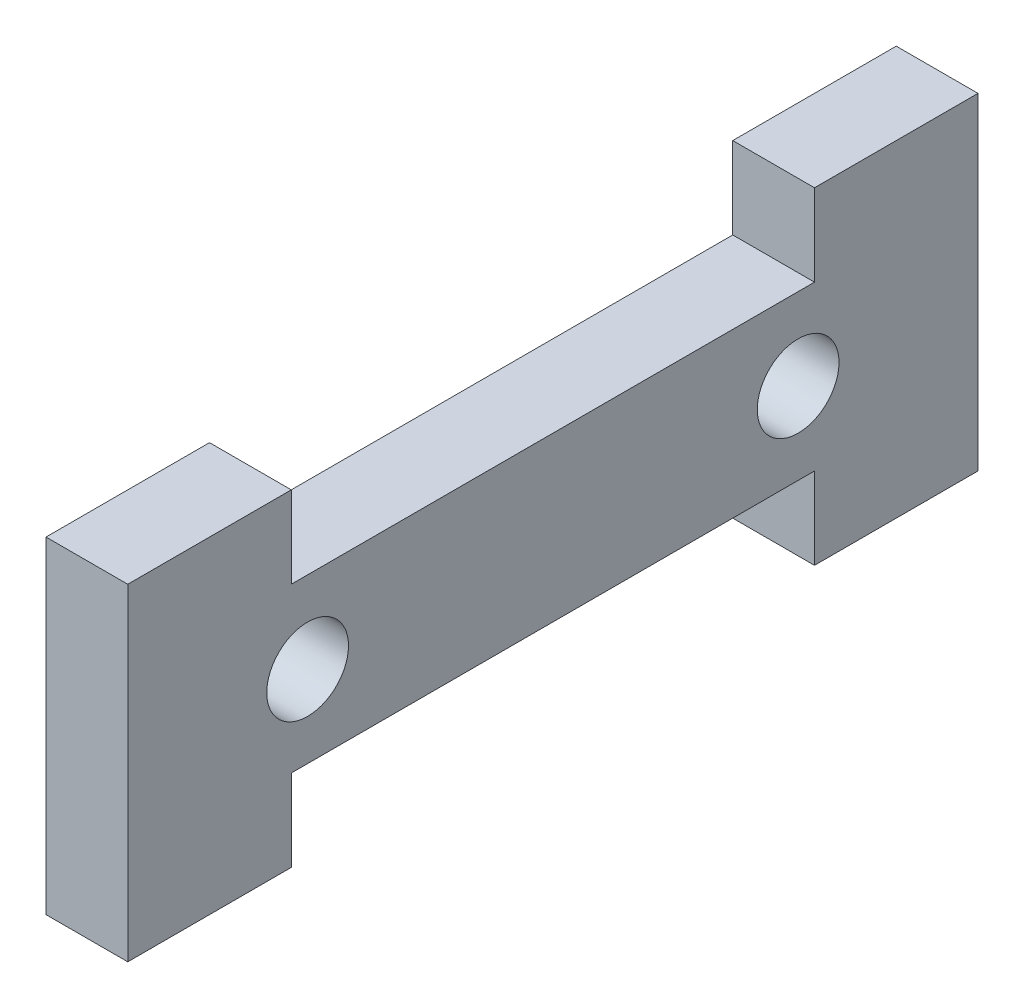
ISO-10303-21;
HEADER;
FILE_DESCRIPTION(('STEP AP214'),'2;1');
FILE_NAME('part.step','',(''),(''),'','','');
FILE_SCHEMA(('AUTOMOTIVE_DESIGN { 1 0 10303 214 1 1 1 1 }'));
ENDSEC;
DATA;
#1=APPLICATION_CONTEXT('core data for automotive mechanical design processes');
#2=APPLICATION_PROTOCOL_DEFINITION('international standard','automotive_design',2000,#1);
#3=PRODUCT_CONTEXT('',#1,'mechanical');
#4=PRODUCT('Part','Part','',(#3));
#5=PRODUCT_RELATED_PRODUCT_CATEGORY('part','',(#4));
#6=PRODUCT_DEFINITION_FORMATION('','',#4);
#7=PRODUCT_DEFINITION_CONTEXT('part definition',#1,'design');
#8=PRODUCT_DEFINITION('design','',#6,#7);
#9=PRODUCT_DEFINITION_SHAPE('','',#8);
#10=(LENGTH_UNIT() NAMED_UNIT(*) SI_UNIT(.MILLI.,.METRE.));
#11=(NAMED_UNIT(*) PLANE_ANGLE_UNIT() SI_UNIT($,.RADIAN.));
#12=(NAMED_UNIT(*) SI_UNIT($,.STERADIAN.) SOLID_ANGLE_UNIT());
#13=UNCERTAINTY_MEASURE_WITH_UNIT(LENGTH_MEASURE(1.E-05),#10,'distance_accuracy_value','');
#14=(GEOMETRIC_REPRESENTATION_CONTEXT(3) GLOBAL_UNCERTAINTY_ASSIGNED_CONTEXT((#13)) GLOBAL_UNIT_ASSIGNED_CONTEXT((#10,
#11,#12)) REPRESENTATION_CONTEXT('',''));
#15=CARTESIAN_POINT('',(0.,0.,0.));
#16=DIRECTION('',(0.,0.,1.));
#17=DIRECTION('',(1.,0.,0.));
#18=AXIS2_PLACEMENT_3D('',#15,#16,#17);
#19=CARTESIAN_POINT('',(6.35,0.,0.));
#20=DIRECTION('',(1.,0.,0.));
#21=DIRECTION('',(0.,0.,-1.));
#22=AXIS2_PLACEMENT_3D('',#19,#20,#21);
#23=PLANE('',#22);
#24=CARTESIAN_POINT('',(6.35,0.,19.05));
#25=DIRECTION('',(1.,0.,0.));
#26=DIRECTION('',(0.,0.,-1.));
#27=AXIS2_PLACEMENT_3D('',#24,#25,#26);
#28=CIRCLE('',#27,3.175);
#29=CARTESIAN_POINT('',(6.35,0.,15.875));
#30=VERTEX_POINT('',#29);
#31=EDGE_CURVE('E174',#30,#30,#28,.T.);
#32=ORIENTED_EDGE('',*,*,#31,.F.);
#33=EDGE_LOOP('',(#32));
#34=FACE_BOUND('',#33,.T.);
#35=DIRECTION('',(0.,-1.,0.));
#36=VECTOR('',#35,1.);
#37=CARTESIAN_POINT('',(6.35,12.7,33.02));
#38=LINE('',#37,#36);
#39=CARTESIAN_POINT('',(6.35,12.7,33.02));
#40=VERTEX_POINT('',#39);
#41=CARTESIAN_POINT('',(6.35,-12.7,33.02));
#42=VERTEX_POINT('',#41);
#43=EDGE_CURVE('E204',#40,#42,#38,.T.);
#44=ORIENTED_EDGE('',*,*,#43,.T.);
#45=DIRECTION('',(0.,0.,-1.));
#46=VECTOR('',#45,1.);
#47=CARTESIAN_POINT('',(6.35,-12.7,33.02));
#48=LINE('',#47,#46);
#49=CARTESIAN_POINT('',(6.35,-12.7,20.32));
#50=VERTEX_POINT('',#49);
#51=EDGE_CURVE('E116',#42,#50,#48,.T.);
#52=ORIENTED_EDGE('',*,*,#51,.T.);
#53=DIRECTION('',(0.,1.,0.));
#54=VECTOR('',#53,1.);
#55=CARTESIAN_POINT('',(6.35,-12.7,20.32));
#56=LINE('',#55,#54);
#57=CARTESIAN_POINT('',(6.35,-6.35,20.32));
#58=VERTEX_POINT('',#57);
#59=EDGE_CURVE('E241',#50,#58,#56,.T.);
#60=ORIENTED_EDGE('',*,*,#59,.T.);
#61=DIRECTION('',(0.,0.,-1.));
#62=VECTOR('',#61,1.);
#63=CARTESIAN_POINT('',(6.35,-6.35,20.32));
#64=LINE('',#63,#62);
#65=CARTESIAN_POINT('',(6.35,-6.35,-20.32));
#66=VERTEX_POINT('',#65);
#67=EDGE_CURVE('E261',#58,#66,#64,.T.);
#68=ORIENTED_EDGE('',*,*,#67,.T.);
#69=DIRECTION('',(0.,-1.,0.));
#70=VECTOR('',#69,1.);
#71=CARTESIAN_POINT('',(6.35,-6.35,-20.32));
#72=LINE('',#71,#70);
#73=CARTESIAN_POINT('',(6.35,-12.7,-20.32));
#74=VERTEX_POINT('',#73);
#75=EDGE_CURVE('E257',#66,#74,#72,.T.);
#76=ORIENTED_EDGE('',*,*,#75,.T.);
#77=DIRECTION('',(0.,0.,-1.));
#78=VECTOR('',#77,1.);
#79=CARTESIAN_POINT('',(6.35,-12.7,-20.32));
#80=LINE('',#79,#78);
#81=CARTESIAN_POINT('',(6.35,-12.7,-33.02));
#82=VERTEX_POINT('',#81);
#83=EDGE_CURVE('E260',#74,#82,#80,.T.);
#84=ORIENTED_EDGE('',*,*,#83,.T.);
#85=DIRECTION('',(0.,1.,0.));
#86=VECTOR('',#85,1.);
#87=CARTESIAN_POINT('',(6.35,12.7,-33.02));
#88=LINE('',#87,#86);
#89=CARTESIAN_POINT('',(6.35,12.7,-33.02));
#90=VERTEX_POINT('',#89);
#91=EDGE_CURVE('E265',#82,#90,#88,.T.);
#92=ORIENTED_EDGE('',*,*,#91,.T.);
#93=DIRECTION('',(0.,0.,1.));
#94=VECTOR('',#93,1.);
#95=CARTESIAN_POINT('',(6.35,12.7,-20.32));
#96=LINE('',#95,#94);
#97=CARTESIAN_POINT('',(6.35,12.7,-20.32));
#98=VERTEX_POINT('',#97);
#99=EDGE_CURVE('E272',#90,#98,#96,.T.);
#100=ORIENTED_EDGE('',*,*,#99,.T.);
#101=DIRECTION('',(0.,-1.,0.));
#102=VECTOR('',#101,1.);
#103=CARTESIAN_POINT('',(6.35,6.35,-20.32));
#104=LINE('',#103,#102);
#105=CARTESIAN_POINT('',(6.35,6.35,-20.32));
#106=VERTEX_POINT('',#105);
#107=EDGE_CURVE('E147',#98,#106,#104,.T.);
#108=ORIENTED_EDGE('',*,*,#107,.T.);
#109=DIRECTION('',(0.,0.,1.));
#110=VECTOR('',#109,1.);
#111=CARTESIAN_POINT('',(6.35,6.35,20.32));
#112=LINE('',#111,#110);
#113=CARTESIAN_POINT('',(6.35,6.35,20.32));
#114=VERTEX_POINT('',#113);
#115=EDGE_CURVE('E141',#106,#114,#112,.T.);
#116=ORIENTED_EDGE('',*,*,#115,.T.);
#117=DIRECTION('',(0.,1.,0.));
#118=VECTOR('',#117,1.);
#119=CARTESIAN_POINT('',(6.35,12.7,20.32));
#120=LINE('',#119,#118);
#121=CARTESIAN_POINT('',(6.35,12.7,20.32));
#122=VERTEX_POINT('',#121);
#123=EDGE_CURVE('E145',#114,#122,#120,.T.);
#124=ORIENTED_EDGE('',*,*,#123,.T.);
#125=DIRECTION('',(0.,0.,1.));
#126=VECTOR('',#125,1.);
#127=CARTESIAN_POINT('',(6.35,12.7,33.02));
#128=LINE('',#127,#126);
#129=EDGE_CURVE('E61',#122,#40,#128,.T.);
#130=ORIENTED_EDGE('',*,*,#129,.T.);
#131=EDGE_LOOP('',(#44,#52,#60,#68,#76,#84,#92,#100,#108,#116,#124,#130));
#132=FACE_BOUND('',#131,.T.);
#133=CARTESIAN_POINT('',(6.35,0.,-19.05));
#134=DIRECTION('',(1.,0.,0.));
#135=DIRECTION('',(0.,0.,-1.));
#136=AXIS2_PLACEMENT_3D('',#133,#134,#135);
#137=CIRCLE('',#136,3.175);
#138=CARTESIAN_POINT('',(6.35,0.,-22.225));
#139=VERTEX_POINT('',#138);
#140=EDGE_CURVE('E316',#139,#139,#137,.T.);
#141=ORIENTED_EDGE('',*,*,#140,.F.);
#142=EDGE_LOOP('',(#141));
#143=FACE_BOUND('',#142,.T.);
#144=ADVANCED_FACE('F43',(#34,#132,#143),#23,.T.);
#145=CARTESIAN_POINT('',(0.,0.,0.));
#146=DIRECTION('',(1.,0.,0.));
#147=DIRECTION('',(0.,0.,-1.));
#148=AXIS2_PLACEMENT_3D('',#145,#146,#147);
#149=PLANE('',#148);
#150=DIRECTION('',(0.,-1.,0.));
#151=VECTOR('',#150,1.);
#152=CARTESIAN_POINT('',(0.,12.7,33.02));
#153=LINE('',#152,#151);
#154=CARTESIAN_POINT('',(0.,12.7,33.02));
#155=VERTEX_POINT('',#154);
#156=CARTESIAN_POINT('',(0.,-12.7,33.02));
#157=VERTEX_POINT('',#156);
#158=EDGE_CURVE('E169',#155,#157,#153,.T.);
#159=ORIENTED_EDGE('',*,*,#158,.F.);
#160=DIRECTION('',(0.,0.,1.));
#161=VECTOR('',#160,1.);
#162=CARTESIAN_POINT('',(0.,12.7,33.02));
#163=LINE('',#162,#161);
#164=CARTESIAN_POINT('',(0.,12.7,20.32));
#165=VERTEX_POINT('',#164);
#166=EDGE_CURVE('E108',#165,#155,#163,.T.);
#167=ORIENTED_EDGE('',*,*,#166,.F.);
#168=DIRECTION('',(0.,1.,0.));
#169=VECTOR('',#168,1.);
#170=CARTESIAN_POINT('',(0.,12.7,20.32));
#171=LINE('',#170,#169);
#172=CARTESIAN_POINT('',(0.,6.35,20.32));
#173=VERTEX_POINT('',#172);
#174=EDGE_CURVE('E102',#173,#165,#171,.T.);
#175=ORIENTED_EDGE('',*,*,#174,.F.);
#176=DIRECTION('',(0.,0.,1.));
#177=VECTOR('',#176,1.);
#178=CARTESIAN_POINT('',(0.,6.35,20.32));
#179=LINE('',#178,#177);
#180=CARTESIAN_POINT('',(0.,6.35,-20.32));
#181=VERTEX_POINT('',#180);
#182=EDGE_CURVE('E156',#181,#173,#179,.T.);
#183=ORIENTED_EDGE('',*,*,#182,.F.);
#184=DIRECTION('',(0.,-1.,0.));
#185=VECTOR('',#184,1.);
#186=CARTESIAN_POINT('',(0.,6.35,-20.32));
#187=LINE('',#186,#185);
#188=CARTESIAN_POINT('',(0.,12.7,-20.32));
#189=VERTEX_POINT('',#188);
#190=EDGE_CURVE('E195',#189,#181,#187,.T.);
#191=ORIENTED_EDGE('',*,*,#190,.F.);
#192=DIRECTION('',(0.,0.,1.));
#193=VECTOR('',#192,1.);
#194=CARTESIAN_POINT('',(0.,12.7,-20.32));
#195=LINE('',#194,#193);
#196=CARTESIAN_POINT('',(0.,12.7,-33.02));
#197=VERTEX_POINT('',#196);
#198=EDGE_CURVE('E192',#197,#189,#195,.T.);
#199=ORIENTED_EDGE('',*,*,#198,.F.);
#200=DIRECTION('',(0.,1.,0.));
#201=VECTOR('',#200,1.);
#202=CARTESIAN_POINT('',(0.,12.7,-33.02));
#203=LINE('',#202,#201);
#204=CARTESIAN_POINT('',(0.,-12.7,-33.02));
#205=VERTEX_POINT('',#204);
#206=EDGE_CURVE('E189',#205,#197,#203,.T.);
#207=ORIENTED_EDGE('',*,*,#206,.F.);
#208=DIRECTION('',(0.,0.,-1.));
#209=VECTOR('',#208,1.);
#210=CARTESIAN_POINT('',(0.,-12.7,-20.32));
#211=LINE('',#210,#209);
#212=CARTESIAN_POINT('',(0.,-12.7,-20.32));
#213=VERTEX_POINT('',#212);
#214=EDGE_CURVE('E186',#213,#205,#211,.T.);
#215=ORIENTED_EDGE('',*,*,#214,.F.);
#216=DIRECTION('',(0.,-1.,0.));
#217=VECTOR('',#216,1.);
#218=CARTESIAN_POINT('',(0.,-6.35,-20.32));
#219=LINE('',#218,#217);
#220=CARTESIAN_POINT('',(0.,-6.35,-20.32));
#221=VERTEX_POINT('',#220);
#222=EDGE_CURVE('E183',#221,#213,#219,.T.);
#223=ORIENTED_EDGE('',*,*,#222,.F.);
#224=DIRECTION('',(0.,0.,-1.));
#225=VECTOR('',#224,1.);
#226=CARTESIAN_POINT('',(0.,-6.35,20.32));
#227=LINE('',#226,#225);
#228=CARTESIAN_POINT('',(0.,-6.35,20.32));
#229=VERTEX_POINT('',#228);
#230=EDGE_CURVE('E180',#229,#221,#227,.T.);
#231=ORIENTED_EDGE('',*,*,#230,.F.);
#232=DIRECTION('',(0.,1.,0.));
#233=VECTOR('',#232,1.);
#234=CARTESIAN_POINT('',(0.,-12.7,20.32));
#235=LINE('',#234,#233);
#236=CARTESIAN_POINT('',(0.,-12.7,20.32));
#237=VERTEX_POINT('',#236);
#238=EDGE_CURVE('E177',#237,#229,#235,.T.);
#239=ORIENTED_EDGE('',*,*,#238,.F.);
#240=DIRECTION('',(0.,0.,-1.));
#241=VECTOR('',#240,1.);
#242=CARTESIAN_POINT('',(0.,-12.7,33.02));
#243=LINE('',#242,#241);
#244=EDGE_CURVE('E173',#157,#237,#243,.T.);
#245=ORIENTED_EDGE('',*,*,#244,.F.);
#246=EDGE_LOOP('',(#159,#167,#175,#183,#191,#199,#207,#215,#223,#231,#239,#245));
#247=FACE_BOUND('',#246,.T.);
#248=CARTESIAN_POINT('',(0.,0.,19.05));
#249=DIRECTION('',(1.,0.,0.));
#250=DIRECTION('',(0.,0.,-1.));
#251=AXIS2_PLACEMENT_3D('',#248,#249,#250);
#252=CIRCLE('',#251,3.175);
#253=CARTESIAN_POINT('',(0.,0.,15.875));
#254=VERTEX_POINT('',#253);
#255=EDGE_CURVE('E324',#254,#254,#252,.T.);
#256=ORIENTED_EDGE('',*,*,#255,.T.);
#257=EDGE_LOOP('',(#256));
#258=FACE_BOUND('',#257,.T.);
#259=CARTESIAN_POINT('',(0.,0.,-19.05));
#260=DIRECTION('',(1.,0.,0.));
#261=DIRECTION('',(0.,0.,-1.));
#262=AXIS2_PLACEMENT_3D('',#259,#260,#261);
#263=CIRCLE('',#262,3.175);
#264=CARTESIAN_POINT('',(0.,0.,-22.225));
#265=VERTEX_POINT('',#264);
#266=EDGE_CURVE('E319',#265,#265,#263,.T.);
#267=ORIENTED_EDGE('',*,*,#266,.T.);
#268=EDGE_LOOP('',(#267));
#269=FACE_BOUND('',#268,.T.);
#270=ADVANCED_FACE('F245',(#247,#258,#269),#149,.F.);
#271=CARTESIAN_POINT('',(6.35,12.7,33.02));
#272=DIRECTION('',(0.,0.,-1.));
#273=DIRECTION('',(-1.,0.,0.));
#274=AXIS2_PLACEMENT_3D('',#271,#272,#273);
#275=PLANE('',#274);
#276=ORIENTED_EDGE('',*,*,#158,.T.);
#277=DIRECTION('',(-1.,0.,0.));
#278=VECTOR('',#277,1.);
#279=CARTESIAN_POINT('',(6.35,-12.7,33.02));
#280=LINE('',#279,#278);
#281=EDGE_CURVE('E11',#42,#157,#280,.T.);
#282=ORIENTED_EDGE('',*,*,#281,.F.);
#283=ORIENTED_EDGE('',*,*,#43,.F.);
#284=DIRECTION('',(-1.,0.,0.));
#285=VECTOR('',#284,1.);
#286=CARTESIAN_POINT('',(6.35,12.7,33.02));
#287=LINE('',#286,#285);
#288=EDGE_CURVE('E165',#40,#155,#287,.T.);
#289=ORIENTED_EDGE('',*,*,#288,.T.);
#290=EDGE_LOOP('',(#276,#282,#283,#289));
#291=FACE_BOUND('',#290,.T.);
#292=ADVANCED_FACE('F45',(#291),#275,.F.);
#293=CARTESIAN_POINT('',(6.35,-12.7,33.02));
#294=DIRECTION('',(0.,1.,0.));
#295=DIRECTION('',(0.,0.,1.));
#296=AXIS2_PLACEMENT_3D('',#293,#294,#295);
#297=PLANE('',#296);
#298=ORIENTED_EDGE('',*,*,#244,.T.);
#299=DIRECTION('',(-1.,0.,0.));
#300=VECTOR('',#299,1.);
#301=CARTESIAN_POINT('',(6.35,-12.7,20.32));
#302=LINE('',#301,#300);
#303=EDGE_CURVE('E53',#50,#237,#302,.T.);
#304=ORIENTED_EDGE('',*,*,#303,.F.);
#305=ORIENTED_EDGE('',*,*,#51,.F.);
#306=ORIENTED_EDGE('',*,*,#281,.T.);
#307=EDGE_LOOP('',(#298,#304,#305,#306));
#308=FACE_BOUND('',#307,.T.);
#309=ADVANCED_FACE('F432',(#308),#297,.F.);
#310=CARTESIAN_POINT('',(6.35,-12.7,20.32));
#311=DIRECTION('',(0.,0.,1.));
#312=DIRECTION('',(0.,-1.,0.));
#313=AXIS2_PLACEMENT_3D('',#310,#311,#312);
#314=PLANE('',#313);
#315=ORIENTED_EDGE('',*,*,#238,.T.);
#316=DIRECTION('',(-1.,0.,0.));
#317=VECTOR('',#316,1.);
#318=CARTESIAN_POINT('',(6.35,-6.35,20.32));
#319=LINE('',#318,#317);
#320=EDGE_CURVE('E231',#58,#229,#319,.T.);
#321=ORIENTED_EDGE('',*,*,#320,.F.);
#322=ORIENTED_EDGE('',*,*,#59,.F.);
#323=ORIENTED_EDGE('',*,*,#303,.T.);
#324=EDGE_LOOP('',(#315,#321,#322,#323));
#325=FACE_BOUND('',#324,.T.);
#326=ADVANCED_FACE('F239',(#325),#314,.F.);
#327=CARTESIAN_POINT('',(6.35,-6.35,20.32));
#328=DIRECTION('',(0.,1.,0.));
#329=DIRECTION('',(0.,0.,1.));
#330=AXIS2_PLACEMENT_3D('',#327,#328,#329);
#331=PLANE('',#330);
#332=ORIENTED_EDGE('',*,*,#230,.T.);
#333=DIRECTION('',(-1.,0.,0.));
#334=VECTOR('',#333,1.);
#335=CARTESIAN_POINT('',(6.35,-6.35,-20.32));
#336=LINE('',#335,#334);
#337=EDGE_CURVE('E227',#66,#221,#336,.T.);
#338=ORIENTED_EDGE('',*,*,#337,.F.);
#339=ORIENTED_EDGE('',*,*,#67,.F.);
#340=ORIENTED_EDGE('',*,*,#320,.T.);
#341=EDGE_LOOP('',(#332,#338,#339,#340));
#342=FACE_BOUND('',#341,.T.);
#343=ADVANCED_FACE('F251',(#342),#331,.F.);
#344=CARTESIAN_POINT('',(6.35,-6.35,-20.32));
#345=DIRECTION('',(0.,0.,-1.));
#346=DIRECTION('',(0.,1.,0.));
#347=AXIS2_PLACEMENT_3D('',#344,#345,#346);
#348=PLANE('',#347);
#349=ORIENTED_EDGE('',*,*,#222,.T.);
#350=DIRECTION('',(-1.,0.,0.));
#351=VECTOR('',#350,1.);
#352=CARTESIAN_POINT('',(6.35,-12.7,-20.32));
#353=LINE('',#352,#351);
#354=EDGE_CURVE('E223',#74,#213,#353,.T.);
#355=ORIENTED_EDGE('',*,*,#354,.F.);
#356=ORIENTED_EDGE('',*,*,#75,.F.);
#357=ORIENTED_EDGE('',*,*,#337,.T.);
#358=EDGE_LOOP('',(#349,#355,#356,#357));
#359=FACE_BOUND('',#358,.T.);
#360=ADVANCED_FACE('F255',(#359),#348,.F.);
#361=CARTESIAN_POINT('',(6.35,-12.7,-20.32));
#362=DIRECTION('',(0.,1.,0.));
#363=DIRECTION('',(0.,0.,1.));
#364=AXIS2_PLACEMENT_3D('',#361,#362,#363);
#365=PLANE('',#364);
#366=ORIENTED_EDGE('',*,*,#214,.T.);
#367=DIRECTION('',(-1.,0.,0.));
#368=VECTOR('',#367,1.);
#369=CARTESIAN_POINT('',(6.35,-12.7,-33.02));
#370=LINE('',#369,#368);
#371=EDGE_CURVE('E219',#82,#205,#370,.T.);
#372=ORIENTED_EDGE('',*,*,#371,.F.);
#373=ORIENTED_EDGE('',*,*,#83,.F.);
#374=ORIENTED_EDGE('',*,*,#354,.T.);
#375=EDGE_LOOP('',(#366,#372,#373,#374));
#376=FACE_BOUND('',#375,.T.);
#377=ADVANCED_FACE('F393',(#376),#365,.F.);
#378=CARTESIAN_POINT('',(6.35,12.7,-33.02));
#379=DIRECTION('',(0.,0.,1.));
#380=DIRECTION('',(1.,0.,0.));
#381=AXIS2_PLACEMENT_3D('',#378,#379,#380);
#382=PLANE('',#381);
#383=ORIENTED_EDGE('',*,*,#206,.T.);
#384=DIRECTION('',(-1.,0.,0.));
#385=VECTOR('',#384,1.);
#386=CARTESIAN_POINT('',(6.35,12.7,-33.02));
#387=LINE('',#386,#385);
#388=EDGE_CURVE('E215',#90,#197,#387,.T.);
#389=ORIENTED_EDGE('',*,*,#388,.F.);
#390=ORIENTED_EDGE('',*,*,#91,.F.);
#391=ORIENTED_EDGE('',*,*,#371,.T.);
#392=EDGE_LOOP('',(#383,#389,#390,#391));
#393=FACE_BOUND('',#392,.T.);
#394=ADVANCED_FACE('F383',(#393),#382,.F.);
#395=CARTESIAN_POINT('',(6.35,12.7,-20.32));
#396=DIRECTION('',(0.,-1.,0.));
#397=DIRECTION('',(0.,0.,-1.));
#398=AXIS2_PLACEMENT_3D('',#395,#396,#397);
#399=PLANE('',#398);
#400=ORIENTED_EDGE('',*,*,#198,.T.);
#401=DIRECTION('',(-1.,0.,0.));
#402=VECTOR('',#401,1.);
#403=CARTESIAN_POINT('',(6.35,12.7,-20.32));
#404=LINE('',#403,#402);
#405=EDGE_CURVE('E211',#98,#189,#404,.T.);
#406=ORIENTED_EDGE('',*,*,#405,.F.);
#407=ORIENTED_EDGE('',*,*,#99,.F.);
#408=ORIENTED_EDGE('',*,*,#388,.T.);
#409=EDGE_LOOP('',(#400,#406,#407,#408));
#410=FACE_BOUND('',#409,.T.);
#411=ADVANCED_FACE('F280',(#410),#399,.F.);
#412=CARTESIAN_POINT('',(6.35,6.35,-20.32));
#413=DIRECTION('',(0.,0.,-1.));
#414=DIRECTION('',(-1.,0.,0.));
#415=AXIS2_PLACEMENT_3D('',#412,#413,#414);
#416=PLANE('',#415);
#417=ORIENTED_EDGE('',*,*,#190,.T.);
#418=DIRECTION('',(-1.,0.,0.));
#419=VECTOR('',#418,1.);
#420=CARTESIAN_POINT('',(6.35,6.35,-20.32));
#421=LINE('',#420,#419);
#422=EDGE_CURVE('E158',#106,#181,#421,.T.);
#423=ORIENTED_EDGE('',*,*,#422,.F.);
#424=ORIENTED_EDGE('',*,*,#107,.F.);
#425=ORIENTED_EDGE('',*,*,#405,.T.);
#426=EDGE_LOOP('',(#417,#423,#424,#425));
#427=FACE_BOUND('',#426,.T.);
#428=ADVANCED_FACE('F284',(#427),#416,.F.);
#429=CARTESIAN_POINT('',(6.35,6.35,20.32));
#430=DIRECTION('',(0.,-1.,0.));
#431=DIRECTION('',(0.,0.,-1.));
#432=AXIS2_PLACEMENT_3D('',#429,#430,#431);
#433=PLANE('',#432);
#434=ORIENTED_EDGE('',*,*,#182,.T.);
#435=DIRECTION('',(-1.,0.,0.));
#436=VECTOR('',#435,1.);
#437=CARTESIAN_POINT('',(6.35,6.35,20.32));
#438=LINE('',#437,#436);
#439=EDGE_CURVE('E153',#114,#173,#438,.T.);
#440=ORIENTED_EDGE('',*,*,#439,.F.);
#441=ORIENTED_EDGE('',*,*,#115,.F.);
#442=ORIENTED_EDGE('',*,*,#422,.T.);
#443=EDGE_LOOP('',(#434,#440,#441,#442));
#444=FACE_BOUND('',#443,.T.);
#445=ADVANCED_FACE('F154',(#444),#433,.F.);
#446=CARTESIAN_POINT('',(6.35,12.7,20.32));
#447=DIRECTION('',(0.,0.,1.));
#448=DIRECTION('',(1.,0.,0.));
#449=AXIS2_PLACEMENT_3D('',#446,#447,#448);
#450=PLANE('',#449);
#451=ORIENTED_EDGE('',*,*,#174,.T.);
#452=DIRECTION('',(-1.,0.,0.));
#453=VECTOR('',#452,1.);
#454=CARTESIAN_POINT('',(6.35,12.7,20.32));
#455=LINE('',#454,#453);
#456=EDGE_CURVE('E159',#122,#165,#455,.T.);
#457=ORIENTED_EDGE('',*,*,#456,.F.);
#458=ORIENTED_EDGE('',*,*,#123,.F.);
#459=ORIENTED_EDGE('',*,*,#439,.T.);
#460=EDGE_LOOP('',(#451,#457,#458,#459));
#461=FACE_BOUND('',#460,.T.);
#462=ADVANCED_FACE('F161',(#461),#450,.F.);
#463=CARTESIAN_POINT('',(6.35,12.7,33.02));
#464=DIRECTION('',(0.,-1.,0.));
#465=DIRECTION('',(0.,0.,-1.));
#466=AXIS2_PLACEMENT_3D('',#463,#464,#465);
#467=PLANE('',#466);
#468=ORIENTED_EDGE('',*,*,#166,.T.);
#469=ORIENTED_EDGE('',*,*,#288,.F.);
#470=ORIENTED_EDGE('',*,*,#129,.F.);
#471=ORIENTED_EDGE('',*,*,#456,.T.);
#472=EDGE_LOOP('',(#468,#469,#470,#471));
#473=FACE_BOUND('',#472,.T.);
#474=ADVANCED_FACE('F288',(#473),#467,.F.);
#475=CARTESIAN_POINT('',(6.35,0.,19.05));
#476=DIRECTION('',(-1.,0.,0.));
#477=DIRECTION('',(0.,0.,1.));
#478=AXIS2_PLACEMENT_3D('',#475,#476,#477);
#479=CYLINDRICAL_SURFACE('',#478,3.175);
#480=ORIENTED_EDGE('',*,*,#31,.T.);
#481=EDGE_LOOP('',(#480));
#482=FACE_BOUND('',#481,.T.);
#483=ORIENTED_EDGE('',*,*,#255,.F.);
#484=EDGE_LOOP('',(#483));
#485=FACE_BOUND('',#484,.T.);
#486=ADVANCED_FACE('F290',(#482,#485),#479,.F.);
#487=CARTESIAN_POINT('',(6.35,0.,-19.05));
#488=DIRECTION('',(-1.,0.,0.));
#489=DIRECTION('',(0.,0.,1.));
#490=AXIS2_PLACEMENT_3D('',#487,#488,#489);
#491=CYLINDRICAL_SURFACE('',#490,3.175);
#492=ORIENTED_EDGE('',*,*,#140,.T.);
#493=EDGE_LOOP('',(#492));
#494=FACE_BOUND('',#493,.T.);
#495=ORIENTED_EDGE('',*,*,#266,.F.);
#496=EDGE_LOOP('',(#495));
#497=FACE_BOUND('',#496,.T.);
#498=ADVANCED_FACE('F296',(#494,#497),#491,.F.);
#499=CLOSED_SHELL('',(#144,#270,#292,#309,#326,#343,#360,#377,#394,#411,#428,#445,#462,#474,
#486,#498));
#500=MANIFOLD_SOLID_BREP('B2',#499);
#501=ADVANCED_BREP_SHAPE_REPRESENTATION('',(#18,#500),#14);
#502=SHAPE_DEFINITION_REPRESENTATION(#9,#501);
ENDSEC;
END-ISO-10303-21;
